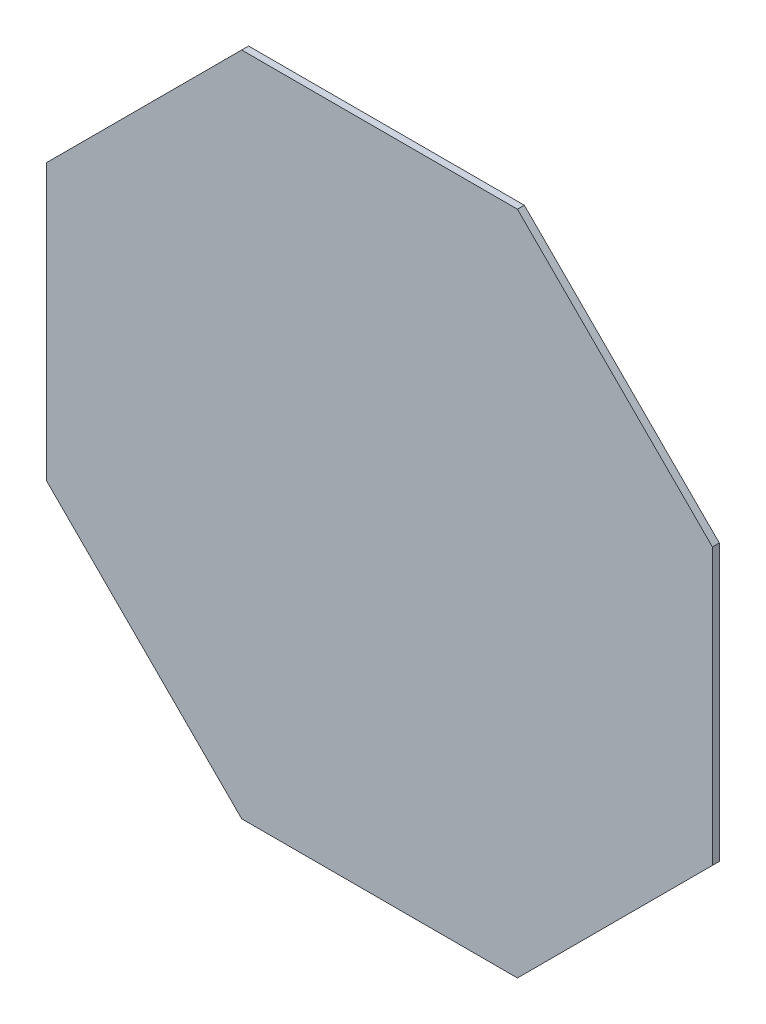
ISO-10303-21;
HEADER;
FILE_DESCRIPTION(('STEP AP214'),'2;1');
FILE_NAME('part.step','',(''),(''),'','','');
FILE_SCHEMA(('AUTOMOTIVE_DESIGN { 1 0 10303 214 1 1 1 1 }'));
ENDSEC;
DATA;
#1=APPLICATION_CONTEXT('core data for automotive mechanical design processes');
#2=APPLICATION_PROTOCOL_DEFINITION('international standard','automotive_design',2000,#1);
#3=PRODUCT_CONTEXT('',#1,'mechanical');
#4=PRODUCT('Part','Part','',(#3));
#5=PRODUCT_RELATED_PRODUCT_CATEGORY('part','',(#4));
#6=PRODUCT_DEFINITION_FORMATION('','',#4);
#7=PRODUCT_DEFINITION_CONTEXT('part definition',#1,'design');
#8=PRODUCT_DEFINITION('design','',#6,#7);
#9=PRODUCT_DEFINITION_SHAPE('','',#8);
#10=(LENGTH_UNIT() NAMED_UNIT(*) SI_UNIT(.MILLI.,.METRE.));
#11=(NAMED_UNIT(*) PLANE_ANGLE_UNIT() SI_UNIT($,.RADIAN.));
#12=(NAMED_UNIT(*) SI_UNIT($,.STERADIAN.) SOLID_ANGLE_UNIT());
#13=UNCERTAINTY_MEASURE_WITH_UNIT(LENGTH_MEASURE(1.E-05),#10,'distance_accuracy_value','');
#14=(GEOMETRIC_REPRESENTATION_CONTEXT(3) GLOBAL_UNCERTAINTY_ASSIGNED_CONTEXT((#13)) GLOBAL_UNIT_ASSIGNED_CONTEXT((#10,
#11,#12)) REPRESENTATION_CONTEXT('',''));
#15=CARTESIAN_POINT('',(0.,0.,0.));
#16=DIRECTION('',(0.,0.,1.));
#17=DIRECTION('',(1.,0.,0.));
#18=AXIS2_PLACEMENT_3D('',#15,#16,#17);
#19=CARTESIAN_POINT('',(-144.852813742386,60.,3.));
#20=DIRECTION('',(1.,0.,0.));
#21=DIRECTION('',(0.,1.,0.));
#22=AXIS2_PLACEMENT_3D('',#19,#20,#21);
#23=PLANE('',#22);
#24=DIRECTION('',(0.,-1.,0.));
#25=VECTOR('',#24,1.);
#26=CARTESIAN_POINT('',(-144.852813742386,60.,0.));
#27=LINE('',#26,#25);
#28=CARTESIAN_POINT('',(-144.852813742386,60.,0.));
#29=VERTEX_POINT('',#28);
#30=CARTESIAN_POINT('',(-144.852813742386,-60.,0.));
#31=VERTEX_POINT('',#30);
#32=EDGE_CURVE('E139',#29,#31,#27,.T.);
#33=ORIENTED_EDGE('',*,*,#32,.T.);
#34=DIRECTION('',(0.,0.,-1.));
#35=VECTOR('',#34,1.);
#36=CARTESIAN_POINT('',(-144.852813742386,-60.,3.));
#37=LINE('',#36,#35);
#38=CARTESIAN_POINT('',(-144.852813742386,-60.,3.));
#39=VERTEX_POINT('',#38);
#40=EDGE_CURVE('E11',#39,#31,#37,.T.);
#41=ORIENTED_EDGE('',*,*,#40,.F.);
#42=DIRECTION('',(0.,-1.,0.));
#43=VECTOR('',#42,1.);
#44=CARTESIAN_POINT('',(-144.852813742386,60.,3.));
#45=LINE('',#44,#43);
#46=CARTESIAN_POINT('',(-144.852813742386,60.,3.));
#47=VERTEX_POINT('',#46);
#48=EDGE_CURVE('E153',#47,#39,#45,.T.);
#49=ORIENTED_EDGE('',*,*,#48,.F.);
#50=DIRECTION('',(0.,0.,-1.));
#51=VECTOR('',#50,1.);
#52=CARTESIAN_POINT('',(-144.852813742386,60.,3.));
#53=LINE('',#52,#51);
#54=EDGE_CURVE('E135',#47,#29,#53,.T.);
#55=ORIENTED_EDGE('',*,*,#54,.T.);
#56=EDGE_LOOP('',(#33,#41,#49,#55));
#57=FACE_BOUND('',#56,.T.);
#58=ADVANCED_FACE('F43',(#57),#23,.F.);
#59=CARTESIAN_POINT('',(-144.852813742386,-60.,3.));
#60=DIRECTION('',(0.707106781186547,0.707106781186548,0.));
#61=DIRECTION('',(-0.707106781186548,0.707106781186547,0.));
#62=AXIS2_PLACEMENT_3D('',#59,#60,#61);
#63=PLANE('',#62);
#64=DIRECTION('',(0.707106781186548,-0.707106781186547,0.));
#65=VECTOR('',#64,1.);
#66=CARTESIAN_POINT('',(-144.852813742386,-60.,0.));
#67=LINE('',#66,#65);
#68=CARTESIAN_POINT('',(-60.,-144.852813742386,0.));
#69=VERTEX_POINT('',#68);
#70=EDGE_CURVE('E142',#31,#69,#67,.T.);
#71=ORIENTED_EDGE('',*,*,#70,.T.);
#72=DIRECTION('',(0.,0.,-1.));
#73=VECTOR('',#72,1.);
#74=CARTESIAN_POINT('',(-60.,-144.852813742386,3.));
#75=LINE('',#74,#73);
#76=CARTESIAN_POINT('',(-60.,-144.852813742386,3.));
#77=VERTEX_POINT('',#76);
#78=EDGE_CURVE('E51',#77,#69,#75,.T.);
#79=ORIENTED_EDGE('',*,*,#78,.F.);
#80=DIRECTION('',(0.707106781186548,-0.707106781186547,0.));
#81=VECTOR('',#80,1.);
#82=CARTESIAN_POINT('',(-144.852813742386,-60.,3.));
#83=LINE('',#82,#81);
#84=EDGE_CURVE('E102',#39,#77,#83,.T.);
#85=ORIENTED_EDGE('',*,*,#84,.F.);
#86=ORIENTED_EDGE('',*,*,#40,.T.);
#87=EDGE_LOOP('',(#71,#79,#85,#86));
#88=FACE_BOUND('',#87,.T.);
#89=ADVANCED_FACE('F188',(#88),#63,.F.);
#90=CARTESIAN_POINT('',(-60.,-144.852813742386,3.));
#91=DIRECTION('',(0.,1.,0.));
#92=DIRECTION('',(-1.,0.,0.));
#93=AXIS2_PLACEMENT_3D('',#90,#91,#92);
#94=PLANE('',#93);
#95=DIRECTION('',(1.,0.,0.));
#96=VECTOR('',#95,1.);
#97=CARTESIAN_POINT('',(-60.,-144.852813742386,0.));
#98=LINE('',#97,#96);
#99=CARTESIAN_POINT('',(60.,-144.852813742386,0.));
#100=VERTEX_POINT('',#99);
#101=EDGE_CURVE('E144',#69,#100,#98,.T.);
#102=ORIENTED_EDGE('',*,*,#101,.T.);
#103=DIRECTION('',(0.,0.,-1.));
#104=VECTOR('',#103,1.);
#105=CARTESIAN_POINT('',(60.,-144.852813742386,3.));
#106=LINE('',#105,#104);
#107=CARTESIAN_POINT('',(60.,-144.852813742386,3.));
#108=VERTEX_POINT('',#107);
#109=EDGE_CURVE('E160',#108,#100,#106,.T.);
#110=ORIENTED_EDGE('',*,*,#109,.F.);
#111=DIRECTION('',(1.,0.,0.));
#112=VECTOR('',#111,1.);
#113=CARTESIAN_POINT('',(-60.,-144.852813742386,3.));
#114=LINE('',#113,#112);
#115=EDGE_CURVE('E168',#77,#108,#114,.T.);
#116=ORIENTED_EDGE('',*,*,#115,.F.);
#117=ORIENTED_EDGE('',*,*,#78,.T.);
#118=EDGE_LOOP('',(#102,#110,#116,#117));
#119=FACE_BOUND('',#118,.T.);
#120=ADVANCED_FACE('F166',(#119),#94,.F.);
#121=CARTESIAN_POINT('',(60.,-144.852813742386,3.));
#122=DIRECTION('',(-0.707106781186547,0.707106781186548,0.));
#123=DIRECTION('',(-0.707106781186548,-0.707106781186547,0.));
#124=AXIS2_PLACEMENT_3D('',#121,#122,#123);
#125=PLANE('',#124);
#126=DIRECTION('',(0.707106781186548,0.707106781186547,0.));
#127=VECTOR('',#126,1.);
#128=CARTESIAN_POINT('',(60.,-144.852813742386,0.));
#129=LINE('',#128,#127);
#130=CARTESIAN_POINT('',(144.852813742386,-60.,0.));
#131=VERTEX_POINT('',#130);
#132=EDGE_CURVE('E146',#100,#131,#129,.T.);
#133=ORIENTED_EDGE('',*,*,#132,.T.);
#134=DIRECTION('',(0.,0.,-1.));
#135=VECTOR('',#134,1.);
#136=CARTESIAN_POINT('',(144.852813742386,-60.,3.));
#137=LINE('',#136,#135);
#138=CARTESIAN_POINT('',(144.852813742386,-60.,3.));
#139=VERTEX_POINT('',#138);
#140=EDGE_CURVE('E157',#139,#131,#137,.T.);
#141=ORIENTED_EDGE('',*,*,#140,.F.);
#142=DIRECTION('',(0.707106781186548,0.707106781186547,0.));
#143=VECTOR('',#142,1.);
#144=CARTESIAN_POINT('',(60.,-144.852813742386,3.));
#145=LINE('',#144,#143);
#146=EDGE_CURVE('E180',#108,#139,#145,.T.);
#147=ORIENTED_EDGE('',*,*,#146,.F.);
#148=ORIENTED_EDGE('',*,*,#109,.T.);
#149=EDGE_LOOP('',(#133,#141,#147,#148));
#150=FACE_BOUND('',#149,.T.);
#151=ADVANCED_FACE('F176',(#150),#125,.F.);
#152=CARTESIAN_POINT('',(144.852813742386,-60.,3.));
#153=DIRECTION('',(-1.,0.,0.));
#154=DIRECTION('',(0.,-1.,0.));
#155=AXIS2_PLACEMENT_3D('',#152,#153,#154);
#156=PLANE('',#155);
#157=DIRECTION('',(0.,1.,0.));
#158=VECTOR('',#157,1.);
#159=CARTESIAN_POINT('',(144.852813742386,-60.,0.));
#160=LINE('',#159,#158);
#161=CARTESIAN_POINT('',(144.852813742386,60.,0.));
#162=VERTEX_POINT('',#161);
#163=EDGE_CURVE('E148',#131,#162,#160,.T.);
#164=ORIENTED_EDGE('',*,*,#163,.T.);
#165=DIRECTION('',(0.,0.,-1.));
#166=VECTOR('',#165,1.);
#167=CARTESIAN_POINT('',(144.852813742386,60.,3.));
#168=LINE('',#167,#166);
#169=CARTESIAN_POINT('',(144.852813742386,60.,3.));
#170=VERTEX_POINT('',#169);
#171=EDGE_CURVE('E130',#170,#162,#168,.T.);
#172=ORIENTED_EDGE('',*,*,#171,.F.);
#173=DIRECTION('',(0.,1.,0.));
#174=VECTOR('',#173,1.);
#175=CARTESIAN_POINT('',(144.852813742386,-60.,3.));
#176=LINE('',#175,#174);
#177=EDGE_CURVE('E121',#139,#170,#176,.T.);
#178=ORIENTED_EDGE('',*,*,#177,.F.);
#179=ORIENTED_EDGE('',*,*,#140,.T.);
#180=EDGE_LOOP('',(#164,#172,#178,#179));
#181=FACE_BOUND('',#180,.T.);
#182=ADVANCED_FACE('F179',(#181),#156,.F.);
#183=CARTESIAN_POINT('',(144.852813742386,60.,3.));
#184=DIRECTION('',(-0.707106781186547,-0.707106781186547,0.));
#185=DIRECTION('',(0.707106781186548,-0.707106781186548,0.));
#186=AXIS2_PLACEMENT_3D('',#183,#184,#185);
#187=PLANE('',#186);
#188=DIRECTION('',(-0.707106781186548,0.707106781186548,0.));
#189=VECTOR('',#188,1.);
#190=CARTESIAN_POINT('',(144.852813742386,60.,0.));
#191=LINE('',#190,#189);
#192=CARTESIAN_POINT('',(60.,144.852813742386,0.));
#193=VERTEX_POINT('',#192);
#194=EDGE_CURVE('E129',#162,#193,#191,.T.);
#195=ORIENTED_EDGE('',*,*,#194,.T.);
#196=DIRECTION('',(0.,0.,-1.));
#197=VECTOR('',#196,1.);
#198=CARTESIAN_POINT('',(60.,144.852813742386,3.));
#199=LINE('',#198,#197);
#200=CARTESIAN_POINT('',(60.,144.852813742386,3.));
#201=VERTEX_POINT('',#200);
#202=EDGE_CURVE('E126',#201,#193,#199,.T.);
#203=ORIENTED_EDGE('',*,*,#202,.F.);
#204=DIRECTION('',(-0.707106781186548,0.707106781186548,0.));
#205=VECTOR('',#204,1.);
#206=CARTESIAN_POINT('',(144.852813742386,60.,3.));
#207=LINE('',#206,#205);
#208=EDGE_CURVE('E115',#170,#201,#207,.T.);
#209=ORIENTED_EDGE('',*,*,#208,.F.);
#210=ORIENTED_EDGE('',*,*,#171,.T.);
#211=EDGE_LOOP('',(#195,#203,#209,#210));
#212=FACE_BOUND('',#211,.T.);
#213=ADVANCED_FACE('F127',(#212),#187,.F.);
#214=CARTESIAN_POINT('',(60.,144.852813742386,3.));
#215=DIRECTION('',(0.,-1.,0.));
#216=DIRECTION('',(0.,0.,-1.));
#217=AXIS2_PLACEMENT_3D('',#214,#215,#216);
#218=PLANE('',#217);
#219=DIRECTION('',(-1.,0.,0.));
#220=VECTOR('',#219,1.);
#221=CARTESIAN_POINT('',(60.,144.852813742386,0.));
#222=LINE('',#221,#220);
#223=CARTESIAN_POINT('',(-60.,144.852813742386,0.));
#224=VERTEX_POINT('',#223);
#225=EDGE_CURVE('E88',#193,#224,#222,.T.);
#226=ORIENTED_EDGE('',*,*,#225,.T.);
#227=DIRECTION('',(0.,0.,-1.));
#228=VECTOR('',#227,1.);
#229=CARTESIAN_POINT('',(-60.,144.852813742386,3.));
#230=LINE('',#229,#228);
#231=CARTESIAN_POINT('',(-60.,144.852813742386,3.));
#232=VERTEX_POINT('',#231);
#233=EDGE_CURVE('E131',#232,#224,#230,.T.);
#234=ORIENTED_EDGE('',*,*,#233,.F.);
#235=DIRECTION('',(-1.,0.,0.));
#236=VECTOR('',#235,1.);
#237=CARTESIAN_POINT('',(60.,144.852813742386,3.));
#238=LINE('',#237,#236);
#239=EDGE_CURVE('E119',#201,#232,#238,.T.);
#240=ORIENTED_EDGE('',*,*,#239,.F.);
#241=ORIENTED_EDGE('',*,*,#202,.T.);
#242=EDGE_LOOP('',(#226,#234,#240,#241));
#243=FACE_BOUND('',#242,.T.);
#244=ADVANCED_FACE('F133',(#243),#218,.F.);
#245=CARTESIAN_POINT('',(-60.,144.852813742386,3.));
#246=DIRECTION('',(0.707106781186547,-0.707106781186548,0.));
#247=DIRECTION('',(0.707106781186548,0.707106781186547,0.));
#248=AXIS2_PLACEMENT_3D('',#245,#246,#247);
#249=PLANE('',#248);
#250=DIRECTION('',(-0.707106781186548,-0.707106781186547,0.));
#251=VECTOR('',#250,1.);
#252=CARTESIAN_POINT('',(-60.,144.852813742386,0.));
#253=LINE('',#252,#251);
#254=EDGE_CURVE('E94',#224,#29,#253,.T.);
#255=ORIENTED_EDGE('',*,*,#254,.T.);
#256=ORIENTED_EDGE('',*,*,#54,.F.);
#257=DIRECTION('',(-0.707106781186548,-0.707106781186547,0.));
#258=VECTOR('',#257,1.);
#259=CARTESIAN_POINT('',(-60.,144.852813742386,3.));
#260=LINE('',#259,#258);
#261=EDGE_CURVE('E59',#232,#47,#260,.T.);
#262=ORIENTED_EDGE('',*,*,#261,.F.);
#263=ORIENTED_EDGE('',*,*,#233,.T.);
#264=EDGE_LOOP('',(#255,#256,#262,#263));
#265=FACE_BOUND('',#264,.T.);
#266=ADVANCED_FACE('F204',(#265),#249,.F.);
#267=CARTESIAN_POINT('',(0.,0.,3.));
#268=DIRECTION('',(0.,0.,1.));
#269=DIRECTION('',(1.,0.,0.));
#270=AXIS2_PLACEMENT_3D('',#267,#268,#269);
#271=PLANE('',#270);
#272=ORIENTED_EDGE('',*,*,#48,.T.);
#273=ORIENTED_EDGE('',*,*,#84,.T.);
#274=ORIENTED_EDGE('',*,*,#115,.T.);
#275=ORIENTED_EDGE('',*,*,#146,.T.);
#276=ORIENTED_EDGE('',*,*,#177,.T.);
#277=ORIENTED_EDGE('',*,*,#208,.T.);
#278=ORIENTED_EDGE('',*,*,#239,.T.);
#279=ORIENTED_EDGE('',*,*,#261,.T.);
#280=EDGE_LOOP('',(#272,#273,#274,#275,#276,#277,#278,#279));
#281=FACE_BOUND('',#280,.T.);
#282=ADVANCED_FACE('F117',(#281),#271,.T.);
#283=CARTESIAN_POINT('',(0.,0.,0.));
#284=DIRECTION('',(0.,0.,1.));
#285=DIRECTION('',(1.,0.,0.));
#286=AXIS2_PLACEMENT_3D('',#283,#284,#285);
#287=PLANE('',#286);
#288=ORIENTED_EDGE('',*,*,#32,.F.);
#289=ORIENTED_EDGE('',*,*,#254,.F.);
#290=ORIENTED_EDGE('',*,*,#225,.F.);
#291=ORIENTED_EDGE('',*,*,#194,.F.);
#292=ORIENTED_EDGE('',*,*,#163,.F.);
#293=ORIENTED_EDGE('',*,*,#132,.F.);
#294=ORIENTED_EDGE('',*,*,#101,.F.);
#295=ORIENTED_EDGE('',*,*,#70,.F.);
#296=EDGE_LOOP('',(#288,#289,#290,#291,#292,#293,#294,#295));
#297=FACE_BOUND('',#296,.T.);
#298=ADVANCED_FACE('F172',(#297),#287,.F.);
#299=CLOSED_SHELL('',(#58,#89,#120,#151,#182,#213,#244,#266,#282,#298));
#300=MANIFOLD_SOLID_BREP('B2',#299);
#301=ADVANCED_BREP_SHAPE_REPRESENTATION('',(#18,#300),#14);
#302=SHAPE_DEFINITION_REPRESENTATION(#9,#301);
ENDSEC;
END-ISO-10303-21;
